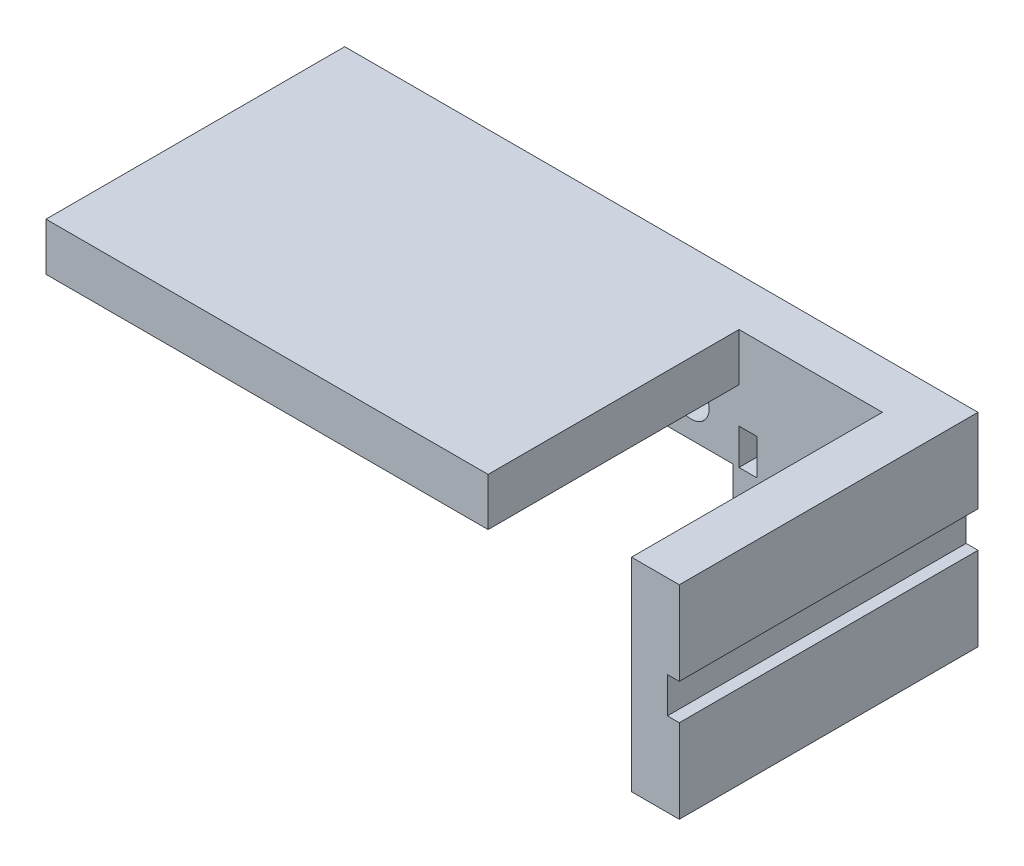
ISO-10303-21;
HEADER;
FILE_DESCRIPTION(('STEP AP214'),'2;1');
FILE_NAME('part.step','',(''),(''),'','','');
FILE_SCHEMA(('AUTOMOTIVE_DESIGN { 1 0 10303 214 1 1 1 1 }'));
ENDSEC;
DATA;
#1=APPLICATION_CONTEXT('core data for automotive mechanical design processes');
#2=APPLICATION_PROTOCOL_DEFINITION('international standard','automotive_design',2000,#1);
#3=PRODUCT_CONTEXT('',#1,'mechanical');
#4=PRODUCT('Part','Part','',(#3));
#5=PRODUCT_RELATED_PRODUCT_CATEGORY('part','',(#4));
#6=PRODUCT_DEFINITION_FORMATION('','',#4);
#7=PRODUCT_DEFINITION_CONTEXT('part definition',#1,'design');
#8=PRODUCT_DEFINITION('design','',#6,#7);
#9=PRODUCT_DEFINITION_SHAPE('','',#8);
#10=(LENGTH_UNIT() NAMED_UNIT(*) SI_UNIT(.MILLI.,.METRE.));
#11=(NAMED_UNIT(*) PLANE_ANGLE_UNIT() SI_UNIT($,.RADIAN.));
#12=(NAMED_UNIT(*) SI_UNIT($,.STERADIAN.) SOLID_ANGLE_UNIT());
#13=UNCERTAINTY_MEASURE_WITH_UNIT(LENGTH_MEASURE(1.E-05),#10,'distance_accuracy_value','');
#14=(GEOMETRIC_REPRESENTATION_CONTEXT(3) GLOBAL_UNCERTAINTY_ASSIGNED_CONTEXT((#13)) GLOBAL_UNIT_ASSIGNED_CONTEXT((#10,
#11,#12)) REPRESENTATION_CONTEXT('',''));
#15=CARTESIAN_POINT('',(0.,0.,0.));
#16=DIRECTION('',(0.,0.,1.));
#17=DIRECTION('',(1.,0.,0.));
#18=AXIS2_PLACEMENT_3D('',#15,#16,#17);
#19=CARTESIAN_POINT('',(15.6542056074766,0.,0.));
#20=DIRECTION('',(-1.,0.,0.));
#21=DIRECTION('',(0.,0.,1.));
#22=AXIS2_PLACEMENT_3D('',#19,#20,#21);
#23=PLANE('',#22);
#24=DIRECTION('',(0.,1.,0.));
#25=VECTOR('',#24,1.);
#26=CARTESIAN_POINT('',(15.6542056074766,6.40186915887851,25.));
#27=LINE('',#26,#25);
#28=CARTESIAN_POINT('',(15.6542056074766,9.40186915887851,25.));
#29=VERTEX_POINT('',#28);
#30=CARTESIAN_POINT('',(15.6542056074766,16.4018691588785,25.));
#31=VERTEX_POINT('',#30);
#32=EDGE_CURVE('E191',#29,#31,#27,.T.);
#33=ORIENTED_EDGE('',*,*,#32,.F.);
#34=DIRECTION('',(0.,0.,-1.));
#35=VECTOR('',#34,1.);
#36=CARTESIAN_POINT('',(15.6542056074766,9.40186915887851,25.));
#37=LINE('',#36,#35);
#38=CARTESIAN_POINT('',(15.6542056074766,9.40186915887851,0.));
#39=VERTEX_POINT('',#38);
#40=EDGE_CURVE('E318',#29,#39,#37,.T.);
#41=ORIENTED_EDGE('',*,*,#40,.T.);
#42=DIRECTION('',(0.,1.,0.));
#43=VECTOR('',#42,1.);
#44=CARTESIAN_POINT('',(15.6542056074766,6.40186915887851,0.));
#45=LINE('',#44,#43);
#46=CARTESIAN_POINT('',(15.6542056074766,16.4018691588785,0.));
#47=VERTEX_POINT('',#46);
#48=EDGE_CURVE('E208',#39,#47,#45,.T.);
#49=ORIENTED_EDGE('',*,*,#48,.T.);
#50=DIRECTION('',(0.,0.,1.));
#51=VECTOR('',#50,1.);
#52=CARTESIAN_POINT('',(15.6542056074766,16.4018691588785,4.));
#53=LINE('',#52,#51);
#54=EDGE_CURVE('E207',#47,#31,#53,.T.);
#55=ORIENTED_EDGE('',*,*,#54,.T.);
#56=EDGE_LOOP('',(#33,#41,#49,#55));
#57=FACE_BOUND('',#56,.T.);
#58=ADVANCED_FACE('F33',(#57),#23,.F.);
#59=CARTESIAN_POINT('',(-37.3457943925234,6.40186915887851,25.));
#60=DIRECTION('',(0.,1.,0.));
#61=DIRECTION('',(-1.,0.,0.));
#62=AXIS2_PLACEMENT_3D('',#59,#60,#61);
#63=PLANE('',#62);
#64=DIRECTION('',(0.,0.,-1.));
#65=VECTOR('',#64,1.);
#66=CARTESIAN_POINT('',(-0.845794392523351,6.40186915887851,4.));
#67=LINE('',#66,#65);
#68=CARTESIAN_POINT('',(-0.845794392523351,6.40186915887851,4.));
#69=VERTEX_POINT('',#68);
#70=CARTESIAN_POINT('',(-0.845794392523351,6.40186915887851,0.));
#71=VERTEX_POINT('',#70);
#72=EDGE_CURVE('E58',#69,#71,#67,.T.);
#73=ORIENTED_EDGE('',*,*,#72,.F.);
#74=DIRECTION('',(1.,0.,0.));
#75=VECTOR('',#74,1.);
#76=CARTESIAN_POINT('',(-37.3457943925234,6.40186915887851,4.));
#77=LINE('',#76,#75);
#78=CARTESIAN_POINT('',(-37.3457943925234,6.40186915887851,4.));
#79=VERTEX_POINT('',#78);
#80=EDGE_CURVE('E229',#79,#69,#77,.T.);
#81=ORIENTED_EDGE('',*,*,#80,.F.);
#82=DIRECTION('',(0.,0.,-1.));
#83=VECTOR('',#82,1.);
#84=CARTESIAN_POINT('',(-37.3457943925234,6.40186915887851,25.));
#85=LINE('',#84,#83);
#86=CARTESIAN_POINT('',(-37.3457943925234,6.40186915887851,0.));
#87=VERTEX_POINT('',#86);
#88=EDGE_CURVE('E11',#79,#87,#85,.T.);
#89=ORIENTED_EDGE('',*,*,#88,.T.);
#90=DIRECTION('',(1.,0.,0.));
#91=VECTOR('',#90,1.);
#92=CARTESIAN_POINT('',(-37.3457943925234,6.40186915887851,0.));
#93=LINE('',#92,#91);
#94=EDGE_CURVE('E249',#87,#71,#93,.T.);
#95=ORIENTED_EDGE('',*,*,#94,.T.);
#96=EDGE_LOOP('',(#73,#81,#89,#95));
#97=FACE_BOUND('',#96,.T.);
#98=ADVANCED_FACE('F381',(#97),#63,.F.);
#99=CARTESIAN_POINT('',(0.,0.,4.));
#100=DIRECTION('',(0.,0.,-1.));
#101=DIRECTION('',(-1.,0.,0.));
#102=AXIS2_PLACEMENT_3D('',#99,#100,#101);
#103=PLANE('',#102);
#104=DIRECTION('',(-1.,0.,0.));
#105=VECTOR('',#104,1.);
#106=CARTESIAN_POINT('',(11.6542056074766,-0.598130841121495,4.));
#107=LINE('',#106,#105);
#108=CARTESIAN_POINT('',(11.6542056074766,-0.598130841121495,4.));
#109=VERTEX_POINT('',#108);
#110=CARTESIAN_POINT('',(-0.845794392523351,-0.598130841121495,4.));
#111=VERTEX_POINT('',#110);
#112=EDGE_CURVE('E443',#109,#111,#107,.T.);
#113=ORIENTED_EDGE('',*,*,#112,.F.);
#114=DIRECTION('',(0.,-1.,0.));
#115=VECTOR('',#114,1.);
#116=CARTESIAN_POINT('',(11.6542056074766,6.40186915887851,4.));
#117=LINE('',#116,#115);
#118=CARTESIAN_POINT('',(11.6542056074766,16.4018691588785,4.));
#119=VERTEX_POINT('',#118);
#120=EDGE_CURVE('E195',#119,#109,#117,.T.);
#121=ORIENTED_EDGE('',*,*,#120,.F.);
#122=DIRECTION('',(-1.,0.,0.));
#123=VECTOR('',#122,1.);
#124=CARTESIAN_POINT('',(15.6542056074766,16.4018691588785,4.));
#125=LINE('',#124,#123);
#126=CARTESIAN_POINT('',(-0.345794392523351,16.4018691588785,4.));
#127=VERTEX_POINT('',#126);
#128=EDGE_CURVE('E37',#119,#127,#125,.T.);
#129=ORIENTED_EDGE('',*,*,#128,.T.);
#130=DIRECTION('',(0.,-1.,0.));
#131=VECTOR('',#130,1.);
#132=CARTESIAN_POINT('',(-0.345794392523351,6.40186915887851,4.));
#133=LINE('',#132,#131);
#134=CARTESIAN_POINT('',(-0.345794392523351,12.4018691588785,4.));
#135=VERTEX_POINT('',#134);
#136=EDGE_CURVE('E205',#127,#135,#133,.T.);
#137=ORIENTED_EDGE('',*,*,#136,.T.);
#138=DIRECTION('',(-1.,0.,0.));
#139=VECTOR('',#138,1.);
#140=CARTESIAN_POINT('',(-37.3457943925234,12.4018691588785,4.));
#141=LINE('',#140,#139);
#142=CARTESIAN_POINT('',(-37.3457943925234,12.4018691588785,4.));
#143=VERTEX_POINT('',#142);
#144=EDGE_CURVE('E231',#135,#143,#141,.T.);
#145=ORIENTED_EDGE('',*,*,#144,.T.);
#146=DIRECTION('',(0.,-1.,0.));
#147=VECTOR('',#146,1.);
#148=CARTESIAN_POINT('',(-37.3457943925234,6.40186915887851,4.));
#149=LINE('',#148,#147);
#150=EDGE_CURVE('E227',#143,#79,#149,.T.);
#151=ORIENTED_EDGE('',*,*,#150,.T.);
#152=ORIENTED_EDGE('',*,*,#80,.T.);
#153=DIRECTION('',(0.,1.,0.));
#154=VECTOR('',#153,1.);
#155=CARTESIAN_POINT('',(-0.845794392523351,-0.598130841121495,4.));
#156=LINE('',#155,#154);
#157=EDGE_CURVE('E309',#111,#69,#156,.T.);
#158=ORIENTED_EDGE('',*,*,#157,.F.);
#159=EDGE_LOOP('',(#113,#121,#129,#137,#145,#151,#152,#158));
#160=FACE_BOUND('',#159,.T.);
#161=CARTESIAN_POINT('',(-33.3457943925233,9.40186915887851,4.));
#162=DIRECTION('',(0.,0.,1.));
#163=DIRECTION('',(1.,0.,0.));
#164=AXIS2_PLACEMENT_3D('',#161,#162,#163);
#165=CIRCLE('',#164,1.5);
#166=CARTESIAN_POINT('',(-31.8457943925233,9.40186915887851,4.));
#167=VERTEX_POINT('',#166);
#168=EDGE_CURVE('E217',#167,#167,#165,.T.);
#169=ORIENTED_EDGE('',*,*,#168,.F.);
#170=EDGE_LOOP('',(#169));
#171=FACE_BOUND('',#170,.T.);
#172=CARTESIAN_POINT('',(-4.34579439252334,9.40186915887851,4.));
#173=DIRECTION('',(0.,0.,1.));
#174=DIRECTION('',(1.,0.,0.));
#175=AXIS2_PLACEMENT_3D('',#172,#173,#174);
#176=CIRCLE('',#175,1.5);
#177=CARTESIAN_POINT('',(-2.84579439252334,9.40186915887851,4.));
#178=VERTEX_POINT('',#177);
#179=EDGE_CURVE('E218',#178,#178,#176,.T.);
#180=ORIENTED_EDGE('',*,*,#179,.F.);
#181=EDGE_LOOP('',(#180));
#182=FACE_BOUND('',#181,.T.);
#183=DIRECTION('',(-1.,0.,0.));
#184=VECTOR('',#183,1.);
#185=CARTESIAN_POINT('',(-0.345794392523351,9.40186915887851,4.));
#186=LINE('',#185,#184);
#187=CARTESIAN_POINT('',(1.15420560747665,9.40186915887851,4.));
#188=VERTEX_POINT('',#187);
#189=CARTESIAN_POINT('',(-0.345794392523351,9.40186915887851,4.));
#190=VERTEX_POINT('',#189);
#191=EDGE_CURVE('E338',#188,#190,#186,.T.);
#192=ORIENTED_EDGE('',*,*,#191,.F.);
#193=DIRECTION('',(0.,1.,0.));
#194=VECTOR('',#193,1.);
#195=CARTESIAN_POINT('',(1.15420560747665,9.40186915887851,4.));
#196=LINE('',#195,#194);
#197=CARTESIAN_POINT('',(1.15420560747665,6.40186915887851,4.));
#198=VERTEX_POINT('',#197);
#199=EDGE_CURVE('E325',#198,#188,#196,.T.);
#200=ORIENTED_EDGE('',*,*,#199,.F.);
#201=DIRECTION('',(-1.,0.,0.));
#202=VECTOR('',#201,1.);
#203=CARTESIAN_POINT('',(11.6542056074766,6.40186915887851,4.));
#204=LINE('',#203,#202);
#205=CARTESIAN_POINT('',(-0.345794392523351,6.40186915887851,4.));
#206=VERTEX_POINT('',#205);
#207=EDGE_CURVE('E315',#198,#206,#204,.T.);
#208=ORIENTED_EDGE('',*,*,#207,.T.);
#209=DIRECTION('',(0.,-1.,0.));
#210=VECTOR('',#209,1.);
#211=CARTESIAN_POINT('',(-0.345794392523351,9.40186915887851,4.));
#212=LINE('',#211,#210);
#213=EDGE_CURVE('E330',#190,#206,#212,.T.);
#214=ORIENTED_EDGE('',*,*,#213,.F.);
#215=EDGE_LOOP('',(#192,#200,#208,#214));
#216=FACE_BOUND('',#215,.T.);
#217=ADVANCED_FACE('F291',(#160,#171,#182,#216),#103,.F.);
#218=CARTESIAN_POINT('',(-0.345794392523351,16.4018691588785,25.));
#219=DIRECTION('',(-1.,0.,0.));
#220=DIRECTION('',(0.,0.,1.));
#221=AXIS2_PLACEMENT_3D('',#218,#219,#220);
#222=PLANE('',#221);
#223=ORIENTED_EDGE('',*,*,#136,.F.);
#224=DIRECTION('',(0.,0.,-1.));
#225=VECTOR('',#224,1.);
#226=CARTESIAN_POINT('',(-0.345794392523351,16.4018691588785,25.));
#227=LINE('',#226,#225);
#228=CARTESIAN_POINT('',(-0.345794392523351,16.4018691588785,25.));
#229=VERTEX_POINT('',#228);
#230=EDGE_CURVE('E42',#229,#127,#227,.T.);
#231=ORIENTED_EDGE('',*,*,#230,.F.);
#232=DIRECTION('',(0.,1.,0.));
#233=VECTOR('',#232,1.);
#234=CARTESIAN_POINT('',(-0.345794392523351,16.4018691588785,25.));
#235=LINE('',#234,#233);
#236=CARTESIAN_POINT('',(-0.345794392523351,12.4018691588785,25.));
#237=VERTEX_POINT('',#236);
#238=EDGE_CURVE('E241',#237,#229,#235,.T.);
#239=ORIENTED_EDGE('',*,*,#238,.F.);
#240=DIRECTION('',(0.,0.,1.));
#241=VECTOR('',#240,1.);
#242=CARTESIAN_POINT('',(-0.345794392523351,12.4018691588785,4.));
#243=LINE('',#242,#241);
#244=EDGE_CURVE('E237',#135,#237,#243,.T.);
#245=ORIENTED_EDGE('',*,*,#244,.F.);
#246=EDGE_LOOP('',(#223,#231,#239,#245));
#247=FACE_BOUND('',#246,.T.);
#248=ADVANCED_FACE('F277',(#247),#222,.F.);
#249=CARTESIAN_POINT('',(-37.3457943925234,16.4018691588785,25.));
#250=DIRECTION('',(1.,0.,0.));
#251=DIRECTION('',(0.,0.,-1.));
#252=AXIS2_PLACEMENT_3D('',#249,#250,#251);
#253=PLANE('',#252);
#254=ORIENTED_EDGE('',*,*,#150,.F.);
#255=DIRECTION('',(0.,0.,1.));
#256=VECTOR('',#255,1.);
#257=CARTESIAN_POINT('',(-37.3457943925234,12.4018691588785,4.));
#258=LINE('',#257,#256);
#259=CARTESIAN_POINT('',(-37.3457943925234,12.4018691588785,25.));
#260=VERTEX_POINT('',#259);
#261=EDGE_CURVE('E233',#143,#260,#258,.T.);
#262=ORIENTED_EDGE('',*,*,#261,.T.);
#263=DIRECTION('',(0.,-1.,0.));
#264=VECTOR('',#263,1.);
#265=CARTESIAN_POINT('',(-37.3457943925234,16.4018691588785,25.));
#266=LINE('',#265,#264);
#267=CARTESIAN_POINT('',(-37.3457943925234,16.4018691588785,25.));
#268=VERTEX_POINT('',#267);
#269=EDGE_CURVE('E238',#268,#260,#266,.T.);
#270=ORIENTED_EDGE('',*,*,#269,.F.);
#271=DIRECTION('',(0.,0.,-1.));
#272=VECTOR('',#271,1.);
#273=CARTESIAN_POINT('',(-37.3457943925234,16.4018691588785,25.));
#274=LINE('',#273,#272);
#275=CARTESIAN_POINT('',(-37.3457943925234,16.4018691588785,0.));
#276=VERTEX_POINT('',#275);
#277=EDGE_CURVE('E246',#268,#276,#274,.T.);
#278=ORIENTED_EDGE('',*,*,#277,.T.);
#279=DIRECTION('',(0.,-1.,0.));
#280=VECTOR('',#279,1.);
#281=CARTESIAN_POINT('',(-37.3457943925234,16.4018691588785,0.));
#282=LINE('',#281,#280);
#283=EDGE_CURVE('E236',#276,#87,#282,.T.);
#284=ORIENTED_EDGE('',*,*,#283,.T.);
#285=ORIENTED_EDGE('',*,*,#88,.F.);
#286=EDGE_LOOP('',(#254,#262,#270,#278,#284,#285));
#287=FACE_BOUND('',#286,.T.);
#288=ADVANCED_FACE('F35',(#287),#253,.F.);
#289=CARTESIAN_POINT('',(-37.3457943925234,16.4018691588785,25.));
#290=DIRECTION('',(0.,-1.,0.));
#291=DIRECTION('',(0.,0.,-1.));
#292=AXIS2_PLACEMENT_3D('',#289,#290,#291);
#293=PLANE('',#292);
#294=DIRECTION('',(-1.,0.,0.));
#295=VECTOR('',#294,1.);
#296=CARTESIAN_POINT('',(-37.3457943925234,16.4018691588785,0.));
#297=LINE('',#296,#295);
#298=EDGE_CURVE('E242',#47,#276,#297,.T.);
#299=ORIENTED_EDGE('',*,*,#298,.T.);
#300=ORIENTED_EDGE('',*,*,#277,.F.);
#301=DIRECTION('',(-1.,0.,0.));
#302=VECTOR('',#301,1.);
#303=CARTESIAN_POINT('',(-37.3457943925234,16.4018691588785,25.));
#304=LINE('',#303,#302);
#305=EDGE_CURVE('E244',#229,#268,#304,.T.);
#306=ORIENTED_EDGE('',*,*,#305,.F.);
#307=ORIENTED_EDGE('',*,*,#230,.T.);
#308=ORIENTED_EDGE('',*,*,#128,.F.);
#309=DIRECTION('',(0.,0.,-1.));
#310=VECTOR('',#309,1.);
#311=CARTESIAN_POINT('',(11.6542056074766,16.4018691588785,25.));
#312=LINE('',#311,#310);
#313=CARTESIAN_POINT('',(11.6542056074766,16.4018691588785,25.));
#314=VERTEX_POINT('',#313);
#315=EDGE_CURVE('E201',#314,#119,#312,.T.);
#316=ORIENTED_EDGE('',*,*,#315,.F.);
#317=DIRECTION('',(-1.,0.,0.));
#318=VECTOR('',#317,1.);
#319=CARTESIAN_POINT('',(15.6542056074766,16.4018691588785,25.));
#320=LINE('',#319,#318);
#321=EDGE_CURVE('E190',#31,#314,#320,.T.);
#322=ORIENTED_EDGE('',*,*,#321,.F.);
#323=ORIENTED_EDGE('',*,*,#54,.F.);
#324=EDGE_LOOP('',(#299,#300,#306,#307,#308,#316,#322,#323));
#325=FACE_BOUND('',#324,.T.);
#326=ADVANCED_FACE('F282',(#325),#293,.F.);
#327=CARTESIAN_POINT('',(0.,0.,25.));
#328=DIRECTION('',(0.,0.,1.));
#329=DIRECTION('',(1.,0.,0.));
#330=AXIS2_PLACEMENT_3D('',#327,#328,#329);
#331=PLANE('',#330);
#332=DIRECTION('',(-1.,0.,0.));
#333=VECTOR('',#332,1.);
#334=CARTESIAN_POINT('',(-37.3457943925234,12.4018691588785,25.));
#335=LINE('',#334,#333);
#336=EDGE_CURVE('E224',#237,#260,#335,.T.);
#337=ORIENTED_EDGE('',*,*,#336,.F.);
#338=ORIENTED_EDGE('',*,*,#238,.T.);
#339=ORIENTED_EDGE('',*,*,#305,.T.);
#340=ORIENTED_EDGE('',*,*,#269,.T.);
#341=EDGE_LOOP('',(#337,#338,#339,#340));
#342=FACE_BOUND('',#341,.T.);
#343=ADVANCED_FACE('F274',(#342),#331,.T.);
#344=CARTESIAN_POINT('',(0.,0.,0.));
#345=DIRECTION('',(0.,0.,1.));
#346=DIRECTION('',(1.,0.,0.));
#347=AXIS2_PLACEMENT_3D('',#344,#345,#346);
#348=PLANE('',#347);
#349=ORIENTED_EDGE('',*,*,#48,.F.);
#350=DIRECTION('',(1.,0.,0.));
#351=VECTOR('',#350,1.);
#352=CARTESIAN_POINT('',(14.6587263543552,9.40186915887851,0.));
#353=LINE('',#352,#351);
#354=CARTESIAN_POINT('',(14.6587263543552,9.40186915887851,0.));
#355=VERTEX_POINT('',#354);
#356=EDGE_CURVE('E174',#355,#39,#353,.T.);
#357=ORIENTED_EDGE('',*,*,#356,.F.);
#358=DIRECTION('',(0.,1.,0.));
#359=VECTOR('',#358,1.);
#360=CARTESIAN_POINT('',(14.6587263543552,6.40186915887851,0.));
#361=LINE('',#360,#359);
#362=CARTESIAN_POINT('',(14.6587263543552,6.40186915887851,0.));
#363=VERTEX_POINT('',#362);
#364=EDGE_CURVE('E434',#363,#355,#361,.T.);
#365=ORIENTED_EDGE('',*,*,#364,.F.);
#366=DIRECTION('',(-1.,0.,0.));
#367=VECTOR('',#366,1.);
#368=CARTESIAN_POINT('',(15.6542056074766,6.40186915887851,0.));
#369=LINE('',#368,#367);
#370=CARTESIAN_POINT('',(15.6542056074766,6.40186915887851,0.));
#371=VERTEX_POINT('',#370);
#372=EDGE_CURVE('E451',#371,#363,#369,.T.);
#373=ORIENTED_EDGE('',*,*,#372,.F.);
#374=CARTESIAN_POINT('',(15.6542056074766,-0.598130841121495,0.));
#375=VERTEX_POINT('',#374);
#376=EDGE_CURVE('E182',#375,#371,#45,.T.);
#377=ORIENTED_EDGE('',*,*,#376,.F.);
#378=DIRECTION('',(1.,0.,0.));
#379=VECTOR('',#378,1.);
#380=CARTESIAN_POINT('',(-0.845794392523351,-0.598130841121495,0.));
#381=LINE('',#380,#379);
#382=CARTESIAN_POINT('',(-0.845794392523351,-0.598130841121495,0.));
#383=VERTEX_POINT('',#382);
#384=EDGE_CURVE('E311',#383,#375,#381,.T.);
#385=ORIENTED_EDGE('',*,*,#384,.F.);
#386=DIRECTION('',(0.,1.,0.));
#387=VECTOR('',#386,1.);
#388=CARTESIAN_POINT('',(-0.845794392523351,-0.598130841121495,0.));
#389=LINE('',#388,#387);
#390=EDGE_CURVE('E306',#383,#71,#389,.T.);
#391=ORIENTED_EDGE('',*,*,#390,.T.);
#392=ORIENTED_EDGE('',*,*,#94,.F.);
#393=ORIENTED_EDGE('',*,*,#283,.F.);
#394=ORIENTED_EDGE('',*,*,#298,.F.);
#395=EDGE_LOOP('',(#349,#357,#365,#373,#377,#385,#391,#392,#393,#394));
#396=FACE_BOUND('',#395,.T.);
#397=DIRECTION('',(1.,0.,0.));
#398=VECTOR('',#397,1.);
#399=CARTESIAN_POINT('',(-0.845794392523351,6.40186915887851,0.));
#400=LINE('',#399,#398);
#401=CARTESIAN_POINT('',(-0.345794392523351,6.40186915887851,0.));
#402=VERTEX_POINT('',#401);
#403=CARTESIAN_POINT('',(1.15420560747665,6.40186915887851,0.));
#404=VERTEX_POINT('',#403);
#405=EDGE_CURVE('E320',#402,#404,#400,.T.);
#406=ORIENTED_EDGE('',*,*,#405,.T.);
#407=DIRECTION('',(0.,1.,0.));
#408=VECTOR('',#407,1.);
#409=CARTESIAN_POINT('',(1.15420560747665,9.40186915887851,0.));
#410=LINE('',#409,#408);
#411=CARTESIAN_POINT('',(1.15420560747665,9.40186915887851,0.));
#412=VERTEX_POINT('',#411);
#413=EDGE_CURVE('E326',#404,#412,#410,.T.);
#414=ORIENTED_EDGE('',*,*,#413,.T.);
#415=DIRECTION('',(-1.,0.,0.));
#416=VECTOR('',#415,1.);
#417=CARTESIAN_POINT('',(-0.345794392523351,9.40186915887851,0.));
#418=LINE('',#417,#416);
#419=CARTESIAN_POINT('',(-0.345794392523351,9.40186915887851,0.));
#420=VERTEX_POINT('',#419);
#421=EDGE_CURVE('E329',#412,#420,#418,.T.);
#422=ORIENTED_EDGE('',*,*,#421,.T.);
#423=DIRECTION('',(0.,-1.,0.));
#424=VECTOR('',#423,1.);
#425=CARTESIAN_POINT('',(-0.345794392523351,9.40186915887851,0.));
#426=LINE('',#425,#424);
#427=EDGE_CURVE('E333',#420,#402,#426,.T.);
#428=ORIENTED_EDGE('',*,*,#427,.T.);
#429=EDGE_LOOP('',(#406,#414,#422,#428));
#430=FACE_BOUND('',#429,.T.);
#431=CARTESIAN_POINT('',(-4.34579439252334,9.40186915887851,0.));
#432=DIRECTION('',(0.,0.,1.));
#433=DIRECTION('',(1.,0.,0.));
#434=AXIS2_PLACEMENT_3D('',#431,#432,#433);
#435=CIRCLE('',#434,1.5);
#436=CARTESIAN_POINT('',(-2.84579439252334,9.40186915887851,0.));
#437=VERTEX_POINT('',#436);
#438=EDGE_CURVE('E214',#437,#437,#435,.T.);
#439=ORIENTED_EDGE('',*,*,#438,.T.);
#440=EDGE_LOOP('',(#439));
#441=FACE_BOUND('',#440,.T.);
#442=CARTESIAN_POINT('',(-33.3457943925233,9.40186915887851,0.));
#443=DIRECTION('',(0.,0.,1.));
#444=DIRECTION('',(1.,0.,0.));
#445=AXIS2_PLACEMENT_3D('',#442,#443,#444);
#446=CIRCLE('',#445,1.5);
#447=CARTESIAN_POINT('',(-31.8457943925233,9.40186915887851,0.));
#448=VERTEX_POINT('',#447);
#449=EDGE_CURVE('E221',#448,#448,#446,.T.);
#450=ORIENTED_EDGE('',*,*,#449,.T.);
#451=EDGE_LOOP('',(#450));
#452=FACE_BOUND('',#451,.T.);
#453=ADVANCED_FACE('F364',(#396,#430,#441,#452),#348,.F.);
#454=CARTESIAN_POINT('',(-37.3457943925234,12.4018691588785,4.));
#455=DIRECTION('',(0.,1.,0.));
#456=DIRECTION('',(0.,0.,1.));
#457=AXIS2_PLACEMENT_3D('',#454,#455,#456);
#458=PLANE('',#457);
#459=ORIENTED_EDGE('',*,*,#336,.T.);
#460=ORIENTED_EDGE('',*,*,#261,.F.);
#461=ORIENTED_EDGE('',*,*,#144,.F.);
#462=ORIENTED_EDGE('',*,*,#244,.T.);
#463=EDGE_LOOP('',(#459,#460,#461,#462));
#464=FACE_BOUND('',#463,.T.);
#465=ADVANCED_FACE('F269',(#464),#458,.F.);
#466=CARTESIAN_POINT('',(-33.3457943925233,9.40186915887851,0.));
#467=DIRECTION('',(0.,0.,1.));
#468=DIRECTION('',(1.,0.,0.));
#469=AXIS2_PLACEMENT_3D('',#466,#467,#468);
#470=CYLINDRICAL_SURFACE('',#469,1.5);
#471=ORIENTED_EDGE('',*,*,#449,.F.);
#472=EDGE_LOOP('',(#471));
#473=FACE_BOUND('',#472,.T.);
#474=ORIENTED_EDGE('',*,*,#168,.T.);
#475=EDGE_LOOP('',(#474));
#476=FACE_BOUND('',#475,.T.);
#477=ADVANCED_FACE('F373',(#473,#476),#470,.F.);
#478=CARTESIAN_POINT('',(-4.34579439252334,9.40186915887851,0.));
#479=DIRECTION('',(0.,0.,1.));
#480=DIRECTION('',(1.,0.,0.));
#481=AXIS2_PLACEMENT_3D('',#478,#479,#480);
#482=CYLINDRICAL_SURFACE('',#481,1.5);
#483=ORIENTED_EDGE('',*,*,#438,.F.);
#484=EDGE_LOOP('',(#483));
#485=FACE_BOUND('',#484,.T.);
#486=ORIENTED_EDGE('',*,*,#179,.T.);
#487=EDGE_LOOP('',(#486));
#488=FACE_BOUND('',#487,.T.);
#489=ADVANCED_FACE('F376',(#485,#488),#482,.F.);
#490=ORIENTED_EDGE('',*,*,#376,.T.);
#491=DIRECTION('',(0.,0.,-1.));
#492=VECTOR('',#491,1.);
#493=CARTESIAN_POINT('',(15.6542056074766,6.40186915887851,25.));
#494=LINE('',#493,#492);
#495=CARTESIAN_POINT('',(15.6542056074766,6.40186915887851,25.));
#496=VERTEX_POINT('',#495);
#497=EDGE_CURVE('E169',#496,#371,#494,.T.);
#498=ORIENTED_EDGE('',*,*,#497,.F.);
#499=CARTESIAN_POINT('',(15.6542056074766,-0.598130841121495,25.));
#500=VERTEX_POINT('',#499);
#501=EDGE_CURVE('E180',#500,#496,#27,.T.);
#502=ORIENTED_EDGE('',*,*,#501,.F.);
#503=DIRECTION('',(0.,0.,1.));
#504=VECTOR('',#503,1.);
#505=CARTESIAN_POINT('',(15.6542056074766,-0.598130841121495,25.));
#506=LINE('',#505,#504);
#507=EDGE_CURVE('E305',#375,#500,#506,.T.);
#508=ORIENTED_EDGE('',*,*,#507,.F.);
#509=EDGE_LOOP('',(#490,#498,#502,#508));
#510=FACE_BOUND('',#509,.T.);
#511=ADVANCED_FACE('F178',(#510),#23,.F.);
#512=CARTESIAN_POINT('',(11.6542056074766,6.40186915887851,25.));
#513=DIRECTION('',(1.,0.,0.));
#514=DIRECTION('',(0.,0.,-1.));
#515=AXIS2_PLACEMENT_3D('',#512,#513,#514);
#516=PLANE('',#515);
#517=ORIENTED_EDGE('',*,*,#120,.T.);
#518=DIRECTION('',(0.,0.,-1.));
#519=VECTOR('',#518,1.);
#520=CARTESIAN_POINT('',(11.6542056074766,-0.598130841121495,25.));
#521=LINE('',#520,#519);
#522=CARTESIAN_POINT('',(11.6542056074766,-0.598130841121495,25.));
#523=VERTEX_POINT('',#522);
#524=EDGE_CURVE('E301',#523,#109,#521,.T.);
#525=ORIENTED_EDGE('',*,*,#524,.F.);
#526=DIRECTION('',(0.,-1.,0.));
#527=VECTOR('',#526,1.);
#528=CARTESIAN_POINT('',(11.6542056074766,6.40186915887851,25.));
#529=LINE('',#528,#527);
#530=EDGE_CURVE('E193',#314,#523,#529,.T.);
#531=ORIENTED_EDGE('',*,*,#530,.F.);
#532=ORIENTED_EDGE('',*,*,#315,.T.);
#533=EDGE_LOOP('',(#517,#525,#531,#532));
#534=FACE_BOUND('',#533,.T.);
#535=ADVANCED_FACE('F299',(#534),#516,.F.);
#536=CARTESIAN_POINT('',(0.,0.,25.));
#537=DIRECTION('',(0.,0.,1.));
#538=DIRECTION('',(1.,0.,0.));
#539=AXIS2_PLACEMENT_3D('',#536,#537,#538);
#540=PLANE('',#539);
#541=DIRECTION('',(1.,0.,0.));
#542=VECTOR('',#541,1.);
#543=CARTESIAN_POINT('',(14.6587263543552,9.40186915887851,25.));
#544=LINE('',#543,#542);
#545=CARTESIAN_POINT('',(14.6587263543552,9.40186915887851,25.));
#546=VERTEX_POINT('',#545);
#547=EDGE_CURVE('E183',#546,#29,#544,.T.);
#548=ORIENTED_EDGE('',*,*,#547,.T.);
#549=ORIENTED_EDGE('',*,*,#32,.T.);
#550=ORIENTED_EDGE('',*,*,#321,.T.);
#551=ORIENTED_EDGE('',*,*,#530,.T.);
#552=DIRECTION('',(-1.,0.,0.));
#553=VECTOR('',#552,1.);
#554=CARTESIAN_POINT('',(11.6542056074766,-0.598130841121495,25.));
#555=LINE('',#554,#553);
#556=EDGE_CURVE('E189',#500,#523,#555,.T.);
#557=ORIENTED_EDGE('',*,*,#556,.F.);
#558=ORIENTED_EDGE('',*,*,#501,.T.);
#559=DIRECTION('',(-1.,0.,0.));
#560=VECTOR('',#559,1.);
#561=CARTESIAN_POINT('',(15.6542056074766,6.40186915887851,25.));
#562=LINE('',#561,#560);
#563=CARTESIAN_POINT('',(14.6587263543552,6.40186915887851,25.));
#564=VERTEX_POINT('',#563);
#565=EDGE_CURVE('E165',#496,#564,#562,.T.);
#566=ORIENTED_EDGE('',*,*,#565,.T.);
#567=DIRECTION('',(0.,1.,0.));
#568=VECTOR('',#567,1.);
#569=CARTESIAN_POINT('',(14.6587263543552,6.40186915887851,25.));
#570=LINE('',#569,#568);
#571=EDGE_CURVE('E50',#564,#546,#570,.T.);
#572=ORIENTED_EDGE('',*,*,#571,.T.);
#573=EDGE_LOOP('',(#548,#549,#550,#551,#557,#558,#566,#572));
#574=FACE_BOUND('',#573,.T.);
#575=ADVANCED_FACE('F187',(#574),#540,.T.);
#576=CARTESIAN_POINT('',(1.15420560747665,9.40186915887851,0.));
#577=DIRECTION('',(1.,0.,0.));
#578=DIRECTION('',(0.,1.,0.));
#579=AXIS2_PLACEMENT_3D('',#576,#577,#578);
#580=PLANE('',#579);
#581=ORIENTED_EDGE('',*,*,#199,.T.);
#582=DIRECTION('',(0.,0.,1.));
#583=VECTOR('',#582,1.);
#584=CARTESIAN_POINT('',(1.15420560747665,9.40186915887851,0.));
#585=LINE('',#584,#583);
#586=EDGE_CURVE('E197',#412,#188,#585,.T.);
#587=ORIENTED_EDGE('',*,*,#586,.F.);
#588=ORIENTED_EDGE('',*,*,#413,.F.);
#589=DIRECTION('',(0.,0.,1.));
#590=VECTOR('',#589,1.);
#591=CARTESIAN_POINT('',(1.15420560747665,6.40186915887851,0.));
#592=LINE('',#591,#590);
#593=EDGE_CURVE('E203',#404,#198,#592,.T.);
#594=ORIENTED_EDGE('',*,*,#593,.T.);
#595=EDGE_LOOP('',(#581,#587,#588,#594));
#596=FACE_BOUND('',#595,.T.);
#597=ADVANCED_FACE('F357',(#596),#580,.F.);
#598=CARTESIAN_POINT('',(-0.345794392523351,9.40186915887851,0.));
#599=DIRECTION('',(-1.,0.,0.));
#600=DIRECTION('',(0.,0.,1.));
#601=AXIS2_PLACEMENT_3D('',#598,#599,#600);
#602=PLANE('',#601);
#603=ORIENTED_EDGE('',*,*,#213,.T.);
#604=DIRECTION('',(0.,0.,1.));
#605=VECTOR('',#604,1.);
#606=CARTESIAN_POINT('',(-0.345794392523351,6.40186915887851,0.));
#607=LINE('',#606,#605);
#608=EDGE_CURVE('E344',#402,#206,#607,.T.);
#609=ORIENTED_EDGE('',*,*,#608,.F.);
#610=ORIENTED_EDGE('',*,*,#427,.F.);
#611=DIRECTION('',(0.,0.,1.));
#612=VECTOR('',#611,1.);
#613=CARTESIAN_POINT('',(-0.345794392523351,9.40186915887851,0.));
#614=LINE('',#613,#612);
#615=EDGE_CURVE('E346',#420,#190,#614,.T.);
#616=ORIENTED_EDGE('',*,*,#615,.T.);
#617=EDGE_LOOP('',(#603,#609,#610,#616));
#618=FACE_BOUND('',#617,.T.);
#619=ADVANCED_FACE('F359',(#618),#602,.F.);
#620=CARTESIAN_POINT('',(-0.345794392523351,9.40186915887851,0.));
#621=DIRECTION('',(0.,1.,0.));
#622=DIRECTION('',(0.,0.,1.));
#623=AXIS2_PLACEMENT_3D('',#620,#621,#622);
#624=PLANE('',#623);
#625=ORIENTED_EDGE('',*,*,#191,.T.);
#626=ORIENTED_EDGE('',*,*,#615,.F.);
#627=ORIENTED_EDGE('',*,*,#421,.F.);
#628=ORIENTED_EDGE('',*,*,#586,.T.);
#629=EDGE_LOOP('',(#625,#626,#627,#628));
#630=FACE_BOUND('',#629,.T.);
#631=ADVANCED_FACE('F351',(#630),#624,.F.);
#632=CARTESIAN_POINT('',(0.,6.40186915887851,0.));
#633=DIRECTION('',(0.,1.,0.));
#634=DIRECTION('',(0.,0.,1.));
#635=AXIS2_PLACEMENT_3D('',#632,#633,#634);
#636=PLANE('',#635);
#637=ORIENTED_EDGE('',*,*,#593,.F.);
#638=ORIENTED_EDGE('',*,*,#405,.F.);
#639=ORIENTED_EDGE('',*,*,#608,.T.);
#640=ORIENTED_EDGE('',*,*,#207,.F.);
#641=EDGE_LOOP('',(#637,#638,#639,#640));
#642=FACE_BOUND('',#641,.T.);
#643=ADVANCED_FACE('F362',(#642),#636,.T.);
#644=CARTESIAN_POINT('',(-0.845794392523351,-0.598130841121495,4.));
#645=DIRECTION('',(1.,0.,0.));
#646=DIRECTION('',(0.,1.,0.));
#647=AXIS2_PLACEMENT_3D('',#644,#645,#646);
#648=PLANE('',#647);
#649=ORIENTED_EDGE('',*,*,#72,.T.);
#650=ORIENTED_EDGE('',*,*,#390,.F.);
#651=DIRECTION('',(0.,0.,-1.));
#652=VECTOR('',#651,1.);
#653=CARTESIAN_POINT('',(-0.845794392523351,-0.598130841121495,4.));
#654=LINE('',#653,#652);
#655=EDGE_CURVE('E441',#111,#383,#654,.T.);
#656=ORIENTED_EDGE('',*,*,#655,.F.);
#657=ORIENTED_EDGE('',*,*,#157,.T.);
#658=EDGE_LOOP('',(#649,#650,#656,#657));
#659=FACE_BOUND('',#658,.T.);
#660=ADVANCED_FACE('F409',(#659),#648,.F.);
#661=CARTESIAN_POINT('',(0.,-0.598130841121495,0.));
#662=DIRECTION('',(0.,1.,0.));
#663=DIRECTION('',(0.,0.,1.));
#664=AXIS2_PLACEMENT_3D('',#661,#662,#663);
#665=PLANE('',#664);
#666=ORIENTED_EDGE('',*,*,#524,.T.);
#667=ORIENTED_EDGE('',*,*,#112,.T.);
#668=ORIENTED_EDGE('',*,*,#655,.T.);
#669=ORIENTED_EDGE('',*,*,#384,.T.);
#670=ORIENTED_EDGE('',*,*,#507,.T.);
#671=ORIENTED_EDGE('',*,*,#556,.T.);
#672=EDGE_LOOP('',(#666,#667,#668,#669,#670,#671));
#673=FACE_BOUND('',#672,.T.);
#674=ADVANCED_FACE('F303',(#673),#665,.F.);
#675=CARTESIAN_POINT('',(14.6587263543552,9.40186915887851,25.));
#676=DIRECTION('',(0.,1.,0.));
#677=DIRECTION('',(-1.,0.,0.));
#678=AXIS2_PLACEMENT_3D('',#675,#676,#677);
#679=PLANE('',#678);
#680=ORIENTED_EDGE('',*,*,#356,.T.);
#681=ORIENTED_EDGE('',*,*,#40,.F.);
#682=ORIENTED_EDGE('',*,*,#547,.F.);
#683=DIRECTION('',(0.,0.,-1.));
#684=VECTOR('',#683,1.);
#685=CARTESIAN_POINT('',(14.6587263543552,9.40186915887851,25.));
#686=LINE('',#685,#684);
#687=EDGE_CURVE('E430',#546,#355,#686,.T.);
#688=ORIENTED_EDGE('',*,*,#687,.T.);
#689=EDGE_LOOP('',(#680,#681,#682,#688));
#690=FACE_BOUND('',#689,.T.);
#691=ADVANCED_FACE('F417',(#690),#679,.F.);
#692=CARTESIAN_POINT('',(14.6587263543552,6.40186915887851,25.));
#693=DIRECTION('',(-1.,0.,0.));
#694=DIRECTION('',(0.,0.,1.));
#695=AXIS2_PLACEMENT_3D('',#692,#693,#694);
#696=PLANE('',#695);
#697=ORIENTED_EDGE('',*,*,#364,.T.);
#698=ORIENTED_EDGE('',*,*,#687,.F.);
#699=ORIENTED_EDGE('',*,*,#571,.F.);
#700=DIRECTION('',(0.,0.,-1.));
#701=VECTOR('',#700,1.);
#702=CARTESIAN_POINT('',(14.6587263543552,6.40186915887851,25.));
#703=LINE('',#702,#701);
#704=EDGE_CURVE('E171',#564,#363,#703,.T.);
#705=ORIENTED_EDGE('',*,*,#704,.T.);
#706=EDGE_LOOP('',(#697,#698,#699,#705));
#707=FACE_BOUND('',#706,.T.);
#708=ADVANCED_FACE('F420',(#707),#696,.F.);
#709=CARTESIAN_POINT('',(15.6542056074766,6.40186915887851,25.));
#710=DIRECTION('',(0.,-1.,0.));
#711=DIRECTION('',(0.,0.,-1.));
#712=AXIS2_PLACEMENT_3D('',#709,#710,#711);
#713=PLANE('',#712);
#714=ORIENTED_EDGE('',*,*,#372,.T.);
#715=ORIENTED_EDGE('',*,*,#704,.F.);
#716=ORIENTED_EDGE('',*,*,#565,.F.);
#717=ORIENTED_EDGE('',*,*,#497,.T.);
#718=EDGE_LOOP('',(#714,#715,#716,#717));
#719=FACE_BOUND('',#718,.T.);
#720=ADVANCED_FACE('F168',(#719),#713,.F.);
#721=CLOSED_SHELL('',(#58,#98,#217,#248,#288,#326,#343,#453,#465,#477,#489,#511,#535,#575,#597,
#619,#631,#643,#660,#674,#691,#708,#720));
#722=MANIFOLD_SOLID_BREP('B2',#721);
#723=ADVANCED_BREP_SHAPE_REPRESENTATION('',(#18,#722),#14);
#724=SHAPE_DEFINITION_REPRESENTATION(#9,#723);
ENDSEC;
END-ISO-10303-21;
